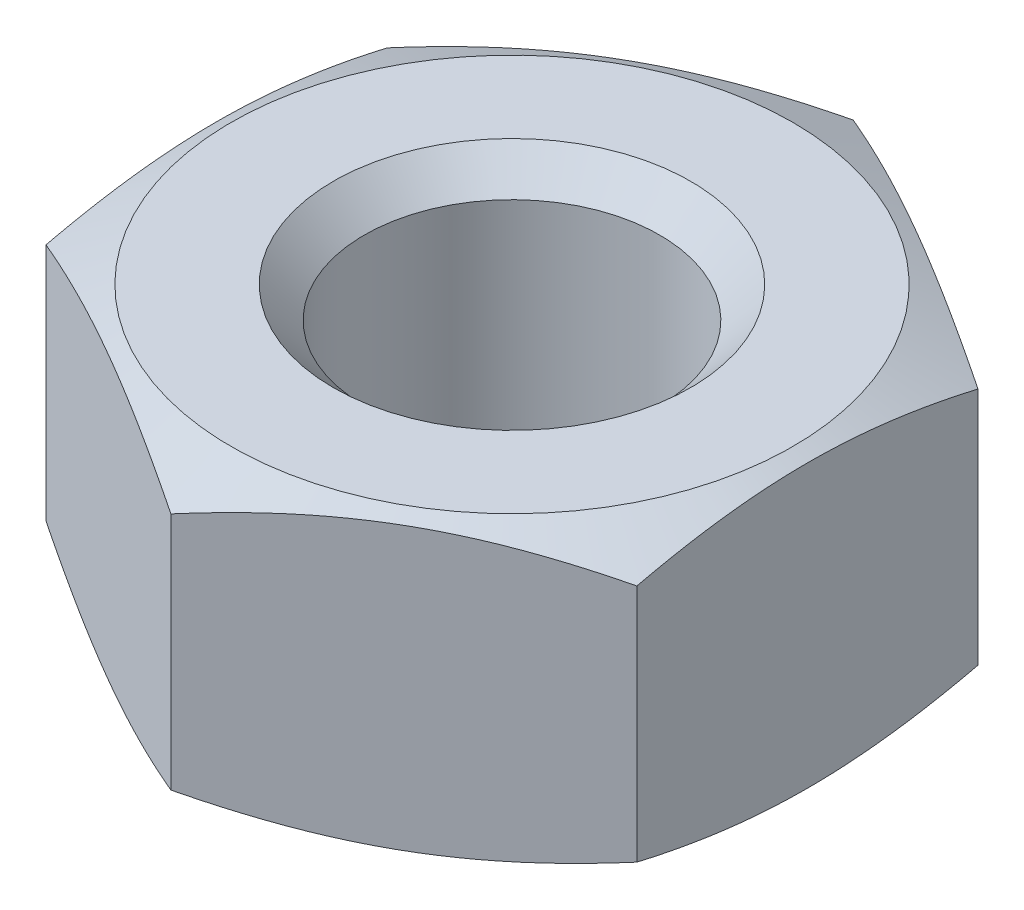
ISO-10303-21;
HEADER;
FILE_DESCRIPTION(('STEP AP214'),'2;1');
FILE_NAME('part.step','',(''),(''),'','','');
FILE_SCHEMA(('AUTOMOTIVE_DESIGN { 1 0 10303 214 1 1 1 1 }'));
ENDSEC;
DATA;
#1=APPLICATION_CONTEXT('core data for automotive mechanical design processes');
#2=APPLICATION_PROTOCOL_DEFINITION('international standard','automotive_design',2000,#1);
#3=PRODUCT_CONTEXT('',#1,'mechanical');
#4=PRODUCT('Part','Part','',(#3));
#5=PRODUCT_RELATED_PRODUCT_CATEGORY('part','',(#4));
#6=PRODUCT_DEFINITION_FORMATION('','',#4);
#7=PRODUCT_DEFINITION_CONTEXT('part definition',#1,'design');
#8=PRODUCT_DEFINITION('design','',#6,#7);
#9=PRODUCT_DEFINITION_SHAPE('','',#8);
#10=(LENGTH_UNIT() NAMED_UNIT(*) SI_UNIT(.MILLI.,.METRE.));
#11=(NAMED_UNIT(*) PLANE_ANGLE_UNIT() SI_UNIT($,.RADIAN.));
#12=(NAMED_UNIT(*) SI_UNIT($,.STERADIAN.) SOLID_ANGLE_UNIT());
#13=UNCERTAINTY_MEASURE_WITH_UNIT(LENGTH_MEASURE(1.E-05),#10,'distance_accuracy_value','');
#14=(GEOMETRIC_REPRESENTATION_CONTEXT(3) GLOBAL_UNCERTAINTY_ASSIGNED_CONTEXT((#13)) GLOBAL_UNIT_ASSIGNED_CONTEXT((#10,
#11,#12)) REPRESENTATION_CONTEXT('',''));
#15=CARTESIAN_POINT('',(0.,0.,0.));
#16=DIRECTION('',(0.,0.,1.));
#17=DIRECTION('',(1.,0.,0.));
#18=AXIS2_PLACEMENT_3D('',#15,#16,#17);
#19=CARTESIAN_POINT('',(5.,2.5,-2.88675134594813));
#20=DIRECTION('',(-0.5,0.,0.866025403784439));
#21=DIRECTION('',(0.866025403784439,0.,0.5));
#22=AXIS2_PLACEMENT_3D('',#19,#20,#21);
#23=PLANE('',#22);
#24=CARTESIAN_POINT('',(-0.000199999999999501,-2.02395974295744,-5.7736181619501));
#25=CARTESIAN_POINT('',(0.151010747855795,-2.06466966086787,-5.68631659597119));
#26=CARTESIAN_POINT('',(0.302779439799255,-2.10276532004087,-5.59869290082308));
#27=CARTESIAN_POINT('',(0.607455751437825,-2.17282066664273,-5.42278795028285));
#28=CARTESIAN_POINT('',(0.760363941140812,-2.20477703433573,-5.33450636579653));
#29=CARTESIAN_POINT('',(1.06732278277276,-2.26162705248396,-5.15728359595019));
#30=CARTESIAN_POINT('',(1.22137437067184,-2.28651405934938,-5.06834187020757));
#31=CARTESIAN_POINT('',(1.53026735132781,-2.32830669777948,-4.89000242467506));
#32=CARTESIAN_POINT('',(1.68510859060131,-2.34521382478051,-4.80060479349884));
#33=CARTESIAN_POINT('',(1.99210751165292,-2.37011273035432,-4.62335888378877));
#34=CARTESIAN_POINT('',(2.14425426385832,-2.37828210107349,-4.53551691544666));
#35=CARTESIAN_POINT('',(2.44872327466207,-2.3859782475379,-4.35973165009921));
#36=CARTESIAN_POINT('',(2.60104554317183,-2.38550450861332,-4.27178834737153));
#37=CARTESIAN_POINT('',(2.9053414063307,-2.37593831564558,-4.09610304886346));
#38=CARTESIAN_POINT('',(3.0573151936295,-2.36685389417962,-4.00836094185674));
#39=CARTESIAN_POINT('',(3.36070746198264,-2.3404574663269,-3.833197334053));
#40=CARTESIAN_POINT('',(3.51212599228864,-2.32314620837124,-3.74577580482053));
#41=CARTESIAN_POINT('',(3.77514799645124,-2.28640873440136,-3.59391997991446));
#42=CARTESIAN_POINT('',(3.886933753904,-2.26868364714663,-3.52938044275754));
#43=CARTESIAN_POINT('',(4.10999421798808,-2.22940536921134,-3.40059642377304));
#44=CARTESIAN_POINT('',(4.22126894566646,-2.20785233766406,-3.33635192979392));
#45=CARTESIAN_POINT('',(4.44416714066287,-2.16108261334641,-3.20766159691086));
#46=CARTESIAN_POINT('',(4.55578612367714,-2.13583763996531,-3.1432183470209));
#47=CARTESIAN_POINT('',(4.77843385126708,-2.08218251009927,-3.01467262156239));
#48=CARTESIAN_POINT('',(4.88946269147448,-2.05377288390758,-2.95057009078084));
#49=CARTESIAN_POINT('',(5.0002,-2.02395974295745,-2.88663587589429));
#50=B_SPLINE_CURVE_WITH_KNOTS('',3,(#24,#25,#26,#27,#28,#29,#30,#31,#32,#33,#34,#35,#36,#37,#38,
#39,#40,#41,#42,#43,#44,#45,#46,#47,#48,#49),.UNSPECIFIED.,.F.,.F.,(4,2,2,2,2,2,2,2,2,2,2,2,4),
(0.,0.537889229661451,1.07606850174431,1.61475187908572,2.15333426657726,2.68074905314433,
3.20819524569605,3.73514988757238,4.26205659926678,4.65287058940701,5.04366833663648,
5.43763379170937,5.83153332996492),.UNSPECIFIED.);
#51=CARTESIAN_POINT('',(0.,-2.02401358914314,-5.77350269189626));
#52=VERTEX_POINT('',#51);
#53=CARTESIAN_POINT('',(5.,-2.02401358914314,-2.88675134594813));
#54=VERTEX_POINT('',#53);
#55=EDGE_CURVE('E59',#52,#54,#50,.T.);
#56=ORIENTED_EDGE('',*,*,#55,.F.);
#57=DIRECTION('',(0.,-1.,0.));
#58=VECTOR('',#57,1.);
#59=CARTESIAN_POINT('',(0.,2.5,-5.77350269189626));
#60=LINE('',#59,#58);
#61=CARTESIAN_POINT('',(0.,2.02401358914314,-5.77350269189626));
#62=VERTEX_POINT('',#61);
#63=EDGE_CURVE('E11',#62,#52,#60,.T.);
#64=ORIENTED_EDGE('',*,*,#63,.F.);
#65=CARTESIAN_POINT('',(5.0002,2.02395974295745,-2.88663587589429));
#66=CARTESIAN_POINT('',(4.8489892521442,2.06466966086787,-2.9739374418732));
#67=CARTESIAN_POINT('',(4.69722056020074,2.10276532004087,-3.06156113702132));
#68=CARTESIAN_POINT('',(4.39254424856217,2.17282066664273,-3.23746608756155));
#69=CARTESIAN_POINT('',(4.23963605885919,2.20477703433573,-3.32574767204786));
#70=CARTESIAN_POINT('',(3.93267721722724,2.26162705248396,-3.50297044189421));
#71=CARTESIAN_POINT('',(3.77862562932816,2.28651405934938,-3.59191216763683));
#72=CARTESIAN_POINT('',(3.46973264867219,2.32830669777948,-3.77025161316934));
#73=CARTESIAN_POINT('',(3.31489140939869,2.34521382478051,-3.85964924434555));
#74=CARTESIAN_POINT('',(3.00789248834708,2.37011273035432,-4.03689515405562));
#75=CARTESIAN_POINT('',(2.85574573614168,2.37828210107349,-4.12473712239773));
#76=CARTESIAN_POINT('',(2.55127672533793,2.3859782475379,-4.30052238774518));
#77=CARTESIAN_POINT('',(2.39895445682817,2.38550450861332,-4.38846569047286));
#78=CARTESIAN_POINT('',(2.0946585936693,2.37593831564558,-4.56415098898093));
#79=CARTESIAN_POINT('',(1.9426848063705,2.36685389417962,-4.65189309598766));
#80=CARTESIAN_POINT('',(1.63929253801736,2.3404574663269,-4.8270567037914));
#81=CARTESIAN_POINT('',(1.48787400771136,2.32314620837124,-4.91447823302386));
#82=CARTESIAN_POINT('',(1.22485200354876,2.28640873440136,-5.06633405792993));
#83=CARTESIAN_POINT('',(1.113066246096,2.26868364714663,-5.13087359508685));
#84=CARTESIAN_POINT('',(0.890005782011924,2.22940536921134,-5.25965761407135));
#85=CARTESIAN_POINT('',(0.778731054333542,2.20785233766406,-5.32390210805047));
#86=CARTESIAN_POINT('',(0.555832859337129,2.16108261334641,-5.45259244093353));
#87=CARTESIAN_POINT('',(0.444213876322858,2.13583763996531,-5.51703569082349));
#88=CARTESIAN_POINT('',(0.22156614873292,2.08218251009927,-5.645581416282));
#89=CARTESIAN_POINT('',(0.110537308525522,2.05377288390758,-5.70968394706355));
#90=CARTESIAN_POINT('',(-0.00020000000000042,2.02395974295745,-5.7736181619501));
#91=B_SPLINE_CURVE_WITH_KNOTS('',3,(#65,#66,#67,#68,#69,#70,#71,#72,#73,#74,#75,#76,#77,#78,#79,
#80,#81,#82,#83,#84,#85,#86,#87,#88,#89,#90),.UNSPECIFIED.,.F.,.F.,(4,2,2,2,2,2,2,2,2,2,2,2,4),
(0.,0.537889229661452,1.07606850174431,1.61475187908572,2.15333426657726,2.68074905314434,
3.20819524569605,3.73514988757238,4.26205659926678,4.65287058940702,5.04366833663648,
5.43763379170937,5.83153332996492),.UNSPECIFIED.);
#92=CARTESIAN_POINT('',(5.,2.02401358914314,-2.88675134594813));
#93=VERTEX_POINT('',#92);
#94=EDGE_CURVE('E120',#93,#62,#91,.T.);
#95=ORIENTED_EDGE('',*,*,#94,.F.);
#96=DIRECTION('',(0.,-1.,0.));
#97=VECTOR('',#96,1.);
#98=CARTESIAN_POINT('',(5.,2.5,-2.88675134594813));
#99=LINE('',#98,#97);
#100=EDGE_CURVE('E116',#93,#54,#99,.T.);
#101=ORIENTED_EDGE('',*,*,#100,.T.);
#102=EDGE_LOOP('',(#56,#64,#95,#101));
#103=FACE_BOUND('',#102,.T.);
#104=ADVANCED_FACE('F44',(#103),#23,.F.);
#105=CARTESIAN_POINT('',(0.,2.5,-5.77350269189626));
#106=DIRECTION('',(0.5,0.,0.866025403784439));
#107=DIRECTION('',(0.866025403784439,0.,-0.5));
#108=AXIS2_PLACEMENT_3D('',#105,#106,#107);
#109=PLANE('',#108);
#110=CARTESIAN_POINT('',(-5.0002,-2.02395974295744,-2.88663587589429));
#111=CARTESIAN_POINT('',(-4.84898925214421,-2.06466966086787,-2.9739374418732));
#112=CARTESIAN_POINT('',(-4.69722056020075,-2.10276532004087,-3.06156113702132));
#113=CARTESIAN_POINT('',(-4.39254424856218,-2.17282066664273,-3.23746608756155));
#114=CARTESIAN_POINT('',(-4.23963605885919,-2.20477703433572,-3.32574767204786));
#115=CARTESIAN_POINT('',(-3.93267721722724,-2.26162705248395,-3.50297044189421));
#116=CARTESIAN_POINT('',(-3.77862562932816,-2.28651405934938,-3.59191216763683));
#117=CARTESIAN_POINT('',(-3.4697326486722,-2.32830669777948,-3.77025161316934));
#118=CARTESIAN_POINT('',(-3.31489140939869,-2.34521382478051,-3.85964924434555));
#119=CARTESIAN_POINT('',(-3.00789248834708,-2.37011273035432,-4.03689515405562));
#120=CARTESIAN_POINT('',(-2.85574573614169,-2.37828210107349,-4.12473712239773));
#121=CARTESIAN_POINT('',(-2.55127672533793,-2.3859782475379,-4.30052238774518));
#122=CARTESIAN_POINT('',(-2.39895445682818,-2.38550450861332,-4.38846569047286));
#123=CARTESIAN_POINT('',(-2.0946585936693,-2.37593831564558,-4.56415098898093));
#124=CARTESIAN_POINT('',(-1.9426848063705,-2.36685389417962,-4.65189309598766));
#125=CARTESIAN_POINT('',(-1.63929253801736,-2.3404574663269,-4.82705670379139));
#126=CARTESIAN_POINT('',(-1.48787400771136,-2.32314620837124,-4.91447823302386));
#127=CARTESIAN_POINT('',(-1.22485200354876,-2.28640873440136,-5.06633405792993));
#128=CARTESIAN_POINT('',(-1.113066246096,-2.26868364714663,-5.13087359508685));
#129=CARTESIAN_POINT('',(-0.890005782011924,-2.22940536921134,-5.25965761407135));
#130=CARTESIAN_POINT('',(-0.778731054333543,-2.20785233766406,-5.32390210805047));
#131=CARTESIAN_POINT('',(-0.55583285933713,-2.16108261334641,-5.45259244093353));
#132=CARTESIAN_POINT('',(-0.444213876322859,-2.13583763996531,-5.51703569082349));
#133=CARTESIAN_POINT('',(-0.22156614873292,-2.08218251009927,-5.645581416282));
#134=CARTESIAN_POINT('',(-0.110537308525522,-2.05377288390758,-5.70968394706355));
#135=CARTESIAN_POINT('',(0.000200000000001096,-2.02395974295745,-5.7736181619501));
#136=B_SPLINE_CURVE_WITH_KNOTS('',3,(#110,#111,#112,#113,#114,#115,#116,#117,#118,#119,#120,
#121,#122,#123,#124,#125,#126,#127,#128,#129,#130,#131,#132,#133,#134,#135),.UNSPECIFIED.,.F.,
.F.,(4,2,2,2,2,2,2,2,2,2,2,2,4),(0.,0.537889229661451,1.07606850174431,1.61475187908572,
2.15333426657726,2.68074905314434,3.20819524569605,3.73514988757238,4.26205659926678,
4.65287058940702,5.04366833663648,5.43763379170937,5.83153332996492),.UNSPECIFIED.);
#137=CARTESIAN_POINT('',(-5.,-2.02401358914314,-2.88675134594813));
#138=VERTEX_POINT('',#137);
#139=EDGE_CURVE('E140',#138,#52,#136,.T.);
#140=ORIENTED_EDGE('',*,*,#139,.F.);
#141=DIRECTION('',(0.,-1.,0.));
#142=VECTOR('',#141,1.);
#143=CARTESIAN_POINT('',(-5.,2.5,-2.88675134594813));
#144=LINE('',#143,#142);
#145=CARTESIAN_POINT('',(-5.,2.02401358914327,-2.88675134594827));
#146=VERTEX_POINT('',#145);
#147=EDGE_CURVE('E52',#146,#138,#144,.T.);
#148=ORIENTED_EDGE('',*,*,#147,.F.);
#149=CARTESIAN_POINT('',(0.000200000000000588,2.02395974295744,-5.7736181619501));
#150=CARTESIAN_POINT('',(-0.151010747855794,2.06466966086787,-5.68631659597119));
#151=CARTESIAN_POINT('',(-0.302779439799254,2.10276532004087,-5.59869290082308));
#152=CARTESIAN_POINT('',(-0.607455751437824,2.17282066664273,-5.42278795028285));
#153=CARTESIAN_POINT('',(-0.760363941140811,2.20477703433573,-5.33450636579653));
#154=CARTESIAN_POINT('',(-1.06732278277276,2.26162705248396,-5.15728359595019));
#155=CARTESIAN_POINT('',(-1.22137437067184,2.28651405934938,-5.06834187020757));
#156=CARTESIAN_POINT('',(-1.5302673513278,2.32830669777948,-4.89000242467506));
#157=CARTESIAN_POINT('',(-1.68510859060131,2.34521382478051,-4.80060479349884));
#158=CARTESIAN_POINT('',(-1.99210751165292,2.37011273035432,-4.62335888378877));
#159=CARTESIAN_POINT('',(-2.14425426385831,2.37828210107349,-4.53551691544666));
#160=CARTESIAN_POINT('',(-2.44872327466207,2.3859782475379,-4.35973165009921));
#161=CARTESIAN_POINT('',(-2.60104554317182,2.38550450861332,-4.27178834737153));
#162=CARTESIAN_POINT('',(-2.9053414063307,2.37593831564558,-4.09610304886346));
#163=CARTESIAN_POINT('',(-3.0573151936295,2.36685389417962,-4.00836094185674));
#164=CARTESIAN_POINT('',(-3.36070746198264,2.3404574663269,-3.833197334053));
#165=CARTESIAN_POINT('',(-3.51212599228864,2.32314620837124,-3.74577580482053));
#166=CARTESIAN_POINT('',(-3.77514799645124,2.28640873440136,-3.59391997991446));
#167=CARTESIAN_POINT('',(-3.886933753904,2.26868364714663,-3.52938044275754));
#168=CARTESIAN_POINT('',(-4.10999421798808,2.22940536921134,-3.40059642377304));
#169=CARTESIAN_POINT('',(-4.22126894566646,2.20785233766406,-3.33635192979392));
#170=CARTESIAN_POINT('',(-4.44416714066287,2.16108261334641,-3.20766159691086));
#171=CARTESIAN_POINT('',(-4.55578612367714,2.13583763996531,-3.1432183470209));
#172=CARTESIAN_POINT('',(-4.77843385126708,2.08218251009927,-3.01467262156239));
#173=CARTESIAN_POINT('',(-4.88946269147448,2.05377288390758,-2.95057009078084));
#174=CARTESIAN_POINT('',(-5.0002,2.02395974295745,-2.88663587589429));
#175=B_SPLINE_CURVE_WITH_KNOTS('',3,(#149,#150,#151,#152,#153,#154,#155,#156,#157,#158,#159,
#160,#161,#162,#163,#164,#165,#166,#167,#168,#169,#170,#171,#172,#173,#174),.UNSPECIFIED.,.F.,
.F.,(4,2,2,2,2,2,2,2,2,2,2,2,4),(0.,0.537889229661451,1.07606850174431,1.61475187908572,
2.15333426657726,2.68074905314433,3.20819524569605,3.73514988757238,4.26205659926678,
4.65287058940701,5.04366833663648,5.43763379170937,5.83153332996492),.UNSPECIFIED.);
#176=EDGE_CURVE('E138',#62,#146,#175,.T.);
#177=ORIENTED_EDGE('',*,*,#176,.F.);
#178=ORIENTED_EDGE('',*,*,#63,.T.);
#179=EDGE_LOOP('',(#140,#148,#177,#178));
#180=FACE_BOUND('',#179,.T.);
#181=ADVANCED_FACE('F137',(#180),#109,.F.);
#182=CARTESIAN_POINT('',(-5.,2.5,-2.88675134594813));
#183=DIRECTION('',(1.,0.,0.));
#184=DIRECTION('',(0.,0.,-1.));
#185=AXIS2_PLACEMENT_3D('',#182,#183,#184);
#186=PLANE('',#185);
#187=CARTESIAN_POINT('',(-5.,-0.044355056732801,8.68206422951937));
#188=CARTESIAN_POINT('',(-5.,-0.150884469076181,8.41835004983136));
#189=CARTESIAN_POINT('',(-5.,-0.256433427007577,8.15423225122912));
#190=CARTESIAN_POINT('',(-5.,-0.464928591610989,7.62493349407754));
#191=CARTESIAN_POINT('',(-5.,-0.567874463325021,7.35975240374208));
#192=CARTESIAN_POINT('',(-5.,-0.770937882882647,6.82697393506281));
#193=CARTESIAN_POINT('',(-5.,-0.871041062323284,6.5593710605834));
#194=CARTESIAN_POINT('',(-5.,-1.06698727838262,6.02261491900011));
#195=CARTESIAN_POINT('',(-5.,-1.16283047121933,5.75346170915815));
#196=CARTESIAN_POINT('',(-5.,-1.34807184925945,5.21585645246179));
#197=CARTESIAN_POINT('',(-5.,-1.43752355244403,4.94742294797703));
#198=CARTESIAN_POINT('',(-5.,-1.60929552371131,4.40824161312915));
#199=CARTESIAN_POINT('',(-5.,-1.69161524445637,4.13749360689038));
#200=CARTESIAN_POINT('',(-5.,-1.84673417591742,3.5936075577031));
#201=CARTESIAN_POINT('',(-5.,-1.91954467826691,3.3204727679688));
#202=CARTESIAN_POINT('',(-5.,-2.05279031206892,2.77119019583892));
#203=CARTESIAN_POINT('',(-5.,-2.11322774023882,2.49504298265793));
#204=CARTESIAN_POINT('',(-5.,-2.20302621029005,2.0200006792832));
#205=CARTESIAN_POINT('',(-5.,-2.23632012033309,1.82185262645441));
#206=CARTESIAN_POINT('',(-5.,-2.29356818033828,1.42419953935815));
#207=CARTESIAN_POINT('',(-5.,-2.31752276298611,1.22469456839172));
#208=CARTESIAN_POINT('',(-5.,-2.35494795919522,0.824903595246671));
#209=CARTESIAN_POINT('',(-5.,-2.36842974797415,0.624618655424731));
#210=CARTESIAN_POINT('',(-5.,-2.38423293699881,0.223604646465163));
#211=CARTESIAN_POINT('',(-5.,-2.38655454290924,0.0228755855801934));
#212=CARTESIAN_POINT('',(-5.,-2.37990591658309,-0.378466308609174));
#213=CARTESIAN_POINT('',(-5.,-2.3709315094048,-0.579079071508225));
#214=CARTESIAN_POINT('',(-5.,-2.34217739493285,-0.979521857267586));
#215=CARTESIAN_POINT('',(-5.,-2.32239733699088,-1.17935185451484));
#216=CARTESIAN_POINT('',(-5.,-2.272989768859,-1.5780081686592));
#217=CARTESIAN_POINT('',(-5.,-2.2433508671486,-1.77683305313053));
#218=CARTESIAN_POINT('',(-5.,-2.17548381666928,-2.17301946195068));
#219=CARTESIAN_POINT('',(-5.,-2.13725446483389,-2.37038077732804));
#220=CARTESIAN_POINT('',(-5.,-2.03943959970523,-2.82968647684002));
#221=CARTESIAN_POINT('',(-5.,-1.97699631240073,-3.09101885139498));
#222=CARTESIAN_POINT('',(-5.,-1.8419944231657,-3.61104592530385));
#223=CARTESIAN_POINT('',(-5.,-1.76943463425191,-3.86974031131106));
#224=CARTESIAN_POINT('',(-5.,-1.61650141457036,-4.38492940863246));
#225=CARTESIAN_POINT('',(-5.,-1.53612412876673,-4.64142296611522));
#226=CARTESIAN_POINT('',(-5.,-1.36939229492986,-5.15243128838049));
#227=CARTESIAN_POINT('',(-5.,-1.28303806021906,-5.40694615611264));
#228=CARTESIAN_POINT('',(-5.,-1.10535214489103,-5.91535529177718));
#229=CARTESIAN_POINT('',(-5.,-1.01400212071026,-6.16924311888274));
#230=CARTESIAN_POINT('',(-5.,-0.827656953692517,-6.67568081355491));
#231=CARTESIAN_POINT('',(-5.,-0.732661711287995,-6.92823064436));
#232=CARTESIAN_POINT('',(-5.,-0.540072160435029,-7.43152003905333));
#233=CARTESIAN_POINT('',(-5.,-0.442485910288777,-7.68226269623553));
#234=CARTESIAN_POINT('',(-5.,-0.245012485290529,-8.18281252227002));
#235=CARTESIAN_POINT('',(-5.,-0.14512553963842,-8.43261978145063));
#236=CARTESIAN_POINT('',(-5.,-0.0443550567328003,-8.68206422951937));
#237=B_SPLINE_CURVE_WITH_KNOTS('',3,(#187,#188,#189,#190,#191,#192,#193,#194,#195,#196,#197,
#198,#199,#200,#201,#202,#203,#204,#205,#206,#207,#208,#209,#210,#211,#212,#213,#214,#215,#216,
#217,#218,#219,#220,#221,#222,#223,#224,#225,#226,#227,#228,#229,#230,#231,#232,#233,#234,#235,
#236),.UNSPECIFIED.,.F.,.F.,(4,2,2,2,2,2,2,2,2,2,2,2,2,2,2,2,2,2,2,2,2,2,2,2,4),(0.,
0.853262994718523,1.70663523192458,2.56374647250866,3.42082625598369,4.26958875926238,
5.11841634247064,5.96622664711135,6.81387943635441,7.41646993512965,8.01903251291344,
8.62095122685452,9.22285884833298,9.82498899675586,10.4271386857382,11.0299865668377,
11.6329189276299,12.4387075097962,13.2445907159496,14.0508733612321,14.8571137716898,
15.6665444626183,16.475997278551,17.2831742830016,18.0902712197221),.UNSPECIFIED.);
#238=CARTESIAN_POINT('',(-5.,-2.02401358914314,2.88675134594813));
#239=VERTEX_POINT('',#238);
#240=EDGE_CURVE('E132',#239,#138,#237,.T.);
#241=ORIENTED_EDGE('',*,*,#240,.F.);
#242=DIRECTION('',(0.,-1.,0.));
#243=VECTOR('',#242,1.);
#244=CARTESIAN_POINT('',(-5.,2.5,2.88675134594813));
#245=LINE('',#244,#243);
#246=CARTESIAN_POINT('',(-5.,2.02401358914314,2.88675134594813));
#247=VERTEX_POINT('',#246);
#248=EDGE_CURVE('E118',#247,#239,#245,.T.);
#249=ORIENTED_EDGE('',*,*,#248,.F.);
#250=CARTESIAN_POINT('',(-5.,0.0443550567327995,-8.68206422951937));
#251=CARTESIAN_POINT('',(-5.,0.150884469076181,-8.41835004983137));
#252=CARTESIAN_POINT('',(-5.,0.256433427007577,-8.15423225122912));
#253=CARTESIAN_POINT('',(-5.,0.464928591610988,-7.62493349407755));
#254=CARTESIAN_POINT('',(-5.,0.567874463325019,-7.35975240374208));
#255=CARTESIAN_POINT('',(-5.,0.770937882882646,-6.82697393506282));
#256=CARTESIAN_POINT('',(-5.,0.871041062323283,-6.5593710605834));
#257=CARTESIAN_POINT('',(-5.,1.06698727838262,-6.02261491900012));
#258=CARTESIAN_POINT('',(-5.,1.16283047121933,-5.75346170915815));
#259=CARTESIAN_POINT('',(-5.,1.34807184925944,-5.21585645246179));
#260=CARTESIAN_POINT('',(-5.,1.43752355244403,-4.94742294797703));
#261=CARTESIAN_POINT('',(-5.,1.60929552371131,-4.40824161312915));
#262=CARTESIAN_POINT('',(-5.,1.69161524445637,-4.13749360689038));
#263=CARTESIAN_POINT('',(-5.,1.84673417591742,-3.5936075577031));
#264=CARTESIAN_POINT('',(-5.,1.91954467826691,-3.3204727679688));
#265=CARTESIAN_POINT('',(-5.,2.05279031206892,-2.77119019583892));
#266=CARTESIAN_POINT('',(-5.,2.11322774023882,-2.49504298265793));
#267=CARTESIAN_POINT('',(-5.,2.20302621029005,-2.0200006792832));
#268=CARTESIAN_POINT('',(-5.,2.23632012033309,-1.82185262645441));
#269=CARTESIAN_POINT('',(-5.,2.29356818033828,-1.42419953935815));
#270=CARTESIAN_POINT('',(-5.,2.31752276298611,-1.22469456839172));
#271=CARTESIAN_POINT('',(-5.,2.35494795919522,-0.82490359524667));
#272=CARTESIAN_POINT('',(-5.,2.36842974797415,-0.62461865542473));
#273=CARTESIAN_POINT('',(-5.,2.38423293699881,-0.223604646465162));
#274=CARTESIAN_POINT('',(-5.,2.38655454290924,-0.0228755855801926));
#275=CARTESIAN_POINT('',(-5.,2.37990591658309,0.378466308609175));
#276=CARTESIAN_POINT('',(-5.,2.3709315094048,0.579079071508226));
#277=CARTESIAN_POINT('',(-5.,2.34217739493285,0.979521857267588));
#278=CARTESIAN_POINT('',(-5.,2.32239733699088,1.17935185451484));
#279=CARTESIAN_POINT('',(-5.,2.272989768859,1.5780081686592));
#280=CARTESIAN_POINT('',(-5.,2.24335086714859,1.77683305313053));
#281=CARTESIAN_POINT('',(-5.,2.17548381666928,2.17301946195069));
#282=CARTESIAN_POINT('',(-5.,2.13725446483389,2.37038077732804));
#283=CARTESIAN_POINT('',(-5.,2.03943959970523,2.82968647684003));
#284=CARTESIAN_POINT('',(-5.,1.97699631240073,3.09101885139498));
#285=CARTESIAN_POINT('',(-5.,1.8419944231657,3.61104592530385));
#286=CARTESIAN_POINT('',(-5.,1.76943463425191,3.86974031131106));
#287=CARTESIAN_POINT('',(-5.,1.61650141457036,4.38492940863246));
#288=CARTESIAN_POINT('',(-5.,1.53612412876673,4.64142296611522));
#289=CARTESIAN_POINT('',(-5.,1.36939229492987,5.15243128838049));
#290=CARTESIAN_POINT('',(-5.,1.28303806021906,5.40694615611264));
#291=CARTESIAN_POINT('',(-5.,1.10535214489103,5.91535529177718));
#292=CARTESIAN_POINT('',(-5.,1.01400212071026,6.16924311888274));
#293=CARTESIAN_POINT('',(-5.,0.827656953692516,6.67568081355491));
#294=CARTESIAN_POINT('',(-5.,0.732661711287995,6.92823064436));
#295=CARTESIAN_POINT('',(-5.,0.54007216043503,7.43152003905333));
#296=CARTESIAN_POINT('',(-5.,0.442485910288778,7.68226269623553));
#297=CARTESIAN_POINT('',(-5.,0.24501248529053,8.18281252227002));
#298=CARTESIAN_POINT('',(-5.,0.145125539638421,8.43261978145063));
#299=CARTESIAN_POINT('',(-5.,0.0443550567328014,8.68206422951937));
#300=B_SPLINE_CURVE_WITH_KNOTS('',3,(#250,#251,#252,#253,#254,#255,#256,#257,#258,#259,#260,
#261,#262,#263,#264,#265,#266,#267,#268,#269,#270,#271,#272,#273,#274,#275,#276,#277,#278,#279,
#280,#281,#282,#283,#284,#285,#286,#287,#288,#289,#290,#291,#292,#293,#294,#295,#296,#297,#298,
#299),.UNSPECIFIED.,.F.,.F.,(4,2,2,2,2,2,2,2,2,2,2,2,2,2,2,2,2,2,2,2,2,2,2,2,4),(0.,
0.853262994718523,1.70663523192458,2.56374647250866,3.4208262559837,4.26958875926238,
5.11841634247065,5.96622664711135,6.81387943635441,7.41646993512966,8.01903251291345,
8.62095122685453,9.22285884833299,9.82498899675587,10.4271386857382,11.0299865668377,
11.63291892763,12.4387075097962,13.2445907159496,14.0508733612321,14.8571137716898,
15.6665444626183,16.475997278551,17.2831742830016,18.0902712197221),.UNSPECIFIED.);
#301=EDGE_CURVE('E133',#146,#247,#300,.T.);
#302=ORIENTED_EDGE('',*,*,#301,.F.);
#303=ORIENTED_EDGE('',*,*,#147,.T.);
#304=EDGE_LOOP('',(#241,#249,#302,#303));
#305=FACE_BOUND('',#304,.T.);
#306=ADVANCED_FACE('F130',(#305),#186,.F.);
#307=CARTESIAN_POINT('',(-5.,2.5,2.88675134594813));
#308=DIRECTION('',(0.5,0.,-0.866025403784438));
#309=DIRECTION('',(-0.866025403784439,0.,-0.5));
#310=AXIS2_PLACEMENT_3D('',#307,#308,#309);
#311=PLANE('',#310);
#312=CARTESIAN_POINT('',(0.00019999999999886,-2.02395974295745,5.7736181619501));
#313=CARTESIAN_POINT('',(-0.151010747855795,-2.06466966086787,5.68631659597119));
#314=CARTESIAN_POINT('',(-0.302779439799255,-2.10276532004087,5.59869290082307));
#315=CARTESIAN_POINT('',(-0.607455751437826,-2.17282066664273,5.42278795028284));
#316=CARTESIAN_POINT('',(-0.760363941140813,-2.20477703433573,5.33450636579652));
#317=CARTESIAN_POINT('',(-1.06732278277276,-2.26162705248396,5.15728359595018));
#318=CARTESIAN_POINT('',(-1.22137437067184,-2.28651405934938,5.06834187020756));
#319=CARTESIAN_POINT('',(-1.53026735132781,-2.32830669777948,4.89000242467505));
#320=CARTESIAN_POINT('',(-1.68510859060131,-2.34521382478051,4.80060479349884));
#321=CARTESIAN_POINT('',(-1.99210751165292,-2.37011273035432,4.62335888378877));
#322=CARTESIAN_POINT('',(-2.14425426385832,-2.37828210107349,4.53551691544666));
#323=CARTESIAN_POINT('',(-2.44872327466207,-2.3859782475379,4.35973165009921));
#324=CARTESIAN_POINT('',(-2.60104554317183,-2.38550450861332,4.27178834737153));
#325=CARTESIAN_POINT('',(-2.9053414063307,-2.37593831564558,4.09610304886346));
#326=CARTESIAN_POINT('',(-3.0573151936295,-2.36685389417962,4.00836094185673));
#327=CARTESIAN_POINT('',(-3.36070746198264,-2.3404574663269,3.83319733405299));
#328=CARTESIAN_POINT('',(-3.51212599228864,-2.32314620837124,3.74577580482053));
#329=CARTESIAN_POINT('',(-3.77514799645124,-2.28640873440136,3.59391997991446));
#330=CARTESIAN_POINT('',(-3.886933753904,-2.26868364714663,3.52938044275754));
#331=CARTESIAN_POINT('',(-4.10999421798808,-2.22940536921134,3.40059642377304));
#332=CARTESIAN_POINT('',(-4.22126894566646,-2.20785233766406,3.33635192979392));
#333=CARTESIAN_POINT('',(-4.44416714066287,-2.16108261334641,3.20766159691086));
#334=CARTESIAN_POINT('',(-4.55578612367714,-2.13583763996531,3.1432183470209));
#335=CARTESIAN_POINT('',(-4.77843385126708,-2.08218251009927,3.01467262156239));
#336=CARTESIAN_POINT('',(-4.88946269147448,-2.05377288390758,2.95057009078083));
#337=CARTESIAN_POINT('',(-5.0002,-2.02395974295745,2.88663587589429));
#338=B_SPLINE_CURVE_WITH_KNOTS('',3,(#312,#313,#314,#315,#316,#317,#318,#319,#320,#321,#322,
#323,#324,#325,#326,#327,#328,#329,#330,#331,#332,#333,#334,#335,#336,#337),.UNSPECIFIED.,.F.,
.F.,(4,2,2,2,2,2,2,2,2,2,2,2,4),(0.,0.537889229661452,1.07606850174432,1.61475187908572,
2.15333426657726,2.68074905314434,3.20819524569605,3.73514988757238,4.26205659926679,
4.65287058940702,5.04366833663649,5.43763379170937,5.83153332996492),.UNSPECIFIED.);
#339=CARTESIAN_POINT('',(0.,-2.02401358914314,5.77350269189626));
#340=VERTEX_POINT('',#339);
#341=EDGE_CURVE('E112',#340,#239,#338,.T.);
#342=ORIENTED_EDGE('',*,*,#341,.F.);
#343=DIRECTION('',(0.,-1.,0.));
#344=VECTOR('',#343,1.);
#345=CARTESIAN_POINT('',(0.,2.5,5.77350269189626));
#346=LINE('',#345,#344);
#347=CARTESIAN_POINT('',(0.,2.02401358914314,5.77350269189626));
#348=VERTEX_POINT('',#347);
#349=EDGE_CURVE('E111',#348,#340,#346,.T.);
#350=ORIENTED_EDGE('',*,*,#349,.F.);
#351=CARTESIAN_POINT('',(-5.0002,2.02395974295745,2.88663587589429));
#352=CARTESIAN_POINT('',(-4.84898925214421,2.06466966086787,2.9739374418732));
#353=CARTESIAN_POINT('',(-4.69722056020075,2.10276532004087,3.06156113702131));
#354=CARTESIAN_POINT('',(-4.39254424856218,2.17282066664273,3.23746608756154));
#355=CARTESIAN_POINT('',(-4.23963605885919,2.20477703433573,3.32574767204786));
#356=CARTESIAN_POINT('',(-3.93267721722724,2.26162705248396,3.5029704418942));
#357=CARTESIAN_POINT('',(-3.77862562932816,2.28651405934938,3.59191216763682));
#358=CARTESIAN_POINT('',(-3.4697326486722,2.32830669777948,3.77025161316933));
#359=CARTESIAN_POINT('',(-3.31489140939869,2.34521382478051,3.85964924434555));
#360=CARTESIAN_POINT('',(-3.00789248834708,2.37011273035432,4.03689515405562));
#361=CARTESIAN_POINT('',(-2.85574573614169,2.37828210107349,4.12473712239773));
#362=CARTESIAN_POINT('',(-2.55127672533793,2.3859782475379,4.30052238774518));
#363=CARTESIAN_POINT('',(-2.39895445682818,2.38550450861332,4.38846569047286));
#364=CARTESIAN_POINT('',(-2.0946585936693,2.37593831564558,4.56415098898093));
#365=CARTESIAN_POINT('',(-1.9426848063705,2.36685389417962,4.65189309598765));
#366=CARTESIAN_POINT('',(-1.63929253801736,2.3404574663269,4.82705670379139));
#367=CARTESIAN_POINT('',(-1.48787400771136,2.32314620837124,4.91447823302386));
#368=CARTESIAN_POINT('',(-1.22485200354876,2.28640873440136,5.06633405792993));
#369=CARTESIAN_POINT('',(-1.113066246096,2.26868364714663,5.13087359508685));
#370=CARTESIAN_POINT('',(-0.890005782011926,2.22940536921134,5.25965761407135));
#371=CARTESIAN_POINT('',(-0.778731054333544,2.20785233766406,5.32390210805047));
#372=CARTESIAN_POINT('',(-0.555832859337131,2.16108261334641,5.45259244093353));
#373=CARTESIAN_POINT('',(-0.44421387632286,2.13583763996531,5.51703569082349));
#374=CARTESIAN_POINT('',(-0.221566148732922,2.08218251009927,5.645581416282));
#375=CARTESIAN_POINT('',(-0.110537308525524,2.05377288390758,5.70968394706355));
#376=CARTESIAN_POINT('',(0.000199999999998899,2.02395974295745,5.7736181619501));
#377=B_SPLINE_CURVE_WITH_KNOTS('',3,(#351,#352,#353,#354,#355,#356,#357,#358,#359,#360,#361,
#362,#363,#364,#365,#366,#367,#368,#369,#370,#371,#372,#373,#374,#375,#376),.UNSPECIFIED.,.F.,
.F.,(4,2,2,2,2,2,2,2,2,2,2,2,4),(0.,0.537889229661452,1.07606850174432,1.61475187908572,
2.15333426657726,2.68074905314434,3.20819524569606,3.73514988757238,4.26205659926678,
4.65287058940701,5.04366833663648,5.43763379170937,5.83153332996492),.UNSPECIFIED.);
#378=EDGE_CURVE('E203',#247,#348,#377,.T.);
#379=ORIENTED_EDGE('',*,*,#378,.F.);
#380=ORIENTED_EDGE('',*,*,#248,.T.);
#381=EDGE_LOOP('',(#342,#350,#379,#380));
#382=FACE_BOUND('',#381,.T.);
#383=ADVANCED_FACE('F195',(#382),#311,.F.);
#384=CARTESIAN_POINT('',(0.,2.5,5.77350269189626));
#385=DIRECTION('',(-0.5,0.,-0.866025403784439));
#386=DIRECTION('',(-0.866025403784439,0.,0.5));
#387=AXIS2_PLACEMENT_3D('',#384,#385,#386);
#388=PLANE('',#387);
#389=CARTESIAN_POINT('',(5.0002,-2.02395974295745,2.88663587589429));
#390=CARTESIAN_POINT('',(4.8489892521442,-2.06466966086787,2.9739374418732));
#391=CARTESIAN_POINT('',(4.69722056020074,-2.10276532004087,3.06156113702131));
#392=CARTESIAN_POINT('',(4.39254424856217,-2.17282066664273,3.23746608756155));
#393=CARTESIAN_POINT('',(4.23963605885919,-2.20477703433573,3.32574767204786));
#394=CARTESIAN_POINT('',(3.93267721722724,-2.26162705248396,3.5029704418942));
#395=CARTESIAN_POINT('',(3.77862562932816,-2.28651405934938,3.59191216763682));
#396=CARTESIAN_POINT('',(3.46973264867219,-2.32830669777948,3.77025161316933));
#397=CARTESIAN_POINT('',(3.31489140939869,-2.34521382478051,3.85964924434555));
#398=CARTESIAN_POINT('',(3.00789248834708,-2.37011273035432,4.03689515405562));
#399=CARTESIAN_POINT('',(2.85574573614168,-2.37828210107349,4.12473712239773));
#400=CARTESIAN_POINT('',(2.55127672533793,-2.3859782475379,4.30052238774518));
#401=CARTESIAN_POINT('',(2.39895445682817,-2.38550450861332,4.38846569047286));
#402=CARTESIAN_POINT('',(2.0946585936693,-2.37593831564558,4.56415098898092));
#403=CARTESIAN_POINT('',(1.9426848063705,-2.36685389417962,4.65189309598765));
#404=CARTESIAN_POINT('',(1.63929253801736,-2.3404574663269,4.82705670379139));
#405=CARTESIAN_POINT('',(1.48787400771136,-2.32314620837124,4.91447823302386));
#406=CARTESIAN_POINT('',(1.22485200354876,-2.28640873440136,5.06633405792993));
#407=CARTESIAN_POINT('',(1.113066246096,-2.26868364714663,5.13087359508685));
#408=CARTESIAN_POINT('',(0.890005782011923,-2.22940536921134,5.25965761407135));
#409=CARTESIAN_POINT('',(0.778731054333541,-2.20785233766406,5.32390210805047));
#410=CARTESIAN_POINT('',(0.555832859337129,-2.16108261334641,5.45259244093353));
#411=CARTESIAN_POINT('',(0.444213876322858,-2.13583763996531,5.51703569082349));
#412=CARTESIAN_POINT('',(0.22156614873292,-2.08218251009927,5.645581416282));
#413=CARTESIAN_POINT('',(0.110537308525521,-2.05377288390758,5.70968394706355));
#414=CARTESIAN_POINT('',(-0.000200000000001759,-2.02395974295745,5.7736181619501));
#415=B_SPLINE_CURVE_WITH_KNOTS('',3,(#389,#390,#391,#392,#393,#394,#395,#396,#397,#398,#399,
#400,#401,#402,#403,#404,#405,#406,#407,#408,#409,#410,#411,#412,#413,#414),.UNSPECIFIED.,.F.,
.F.,(4,2,2,2,2,2,2,2,2,2,2,2,4),(0.,0.537889229661451,1.07606850174431,1.61475187908572,
2.15333426657726,2.68074905314433,3.20819524569605,3.73514988757238,4.26205659926678,
4.65287058940701,5.04366833663648,5.43763379170937,5.83153332996492),.UNSPECIFIED.);
#416=CARTESIAN_POINT('',(5.,-2.02401358914314,2.88675134594813));
#417=VERTEX_POINT('',#416);
#418=EDGE_CURVE('E97',#417,#340,#415,.T.);
#419=ORIENTED_EDGE('',*,*,#418,.F.);
#420=DIRECTION('',(0.,-1.,0.));
#421=VECTOR('',#420,1.);
#422=CARTESIAN_POINT('',(5.,2.5,2.88675134594813));
#423=LINE('',#422,#421);
#424=CARTESIAN_POINT('',(5.,2.02401358914314,2.88675134594813));
#425=VERTEX_POINT('',#424);
#426=EDGE_CURVE('E109',#425,#417,#423,.T.);
#427=ORIENTED_EDGE('',*,*,#426,.F.);
#428=CARTESIAN_POINT('',(-0.000200000000001207,2.02395974295745,5.7736181619501));
#429=CARTESIAN_POINT('',(0.151010747855793,2.06466966086787,5.68631659597119));
#430=CARTESIAN_POINT('',(0.302779439799253,2.10276532004087,5.59869290082307));
#431=CARTESIAN_POINT('',(0.607455751437824,2.17282066664273,5.42278795028284));
#432=CARTESIAN_POINT('',(0.760363941140811,2.20477703433573,5.33450636579652));
#433=CARTESIAN_POINT('',(1.06732278277276,2.26162705248396,5.15728359595018));
#434=CARTESIAN_POINT('',(1.22137437067184,2.28651405934938,5.06834187020756));
#435=CARTESIAN_POINT('',(1.5302673513278,2.32830669777948,4.89000242467505));
#436=CARTESIAN_POINT('',(1.68510859060131,2.34521382478051,4.80060479349884));
#437=CARTESIAN_POINT('',(1.99210751165292,2.37011273035432,4.62335888378877));
#438=CARTESIAN_POINT('',(2.14425426385831,2.37828210107349,4.53551691544666));
#439=CARTESIAN_POINT('',(2.44872327466207,2.3859782475379,4.35973165009921));
#440=CARTESIAN_POINT('',(2.60104554317182,2.38550450861332,4.27178834737153));
#441=CARTESIAN_POINT('',(2.9053414063307,2.37593831564558,4.09610304886346));
#442=CARTESIAN_POINT('',(3.0573151936295,2.36685389417962,4.00836094185673));
#443=CARTESIAN_POINT('',(3.36070746198264,2.3404574663269,3.833197334053));
#444=CARTESIAN_POINT('',(3.51212599228864,2.32314620837124,3.74577580482053));
#445=CARTESIAN_POINT('',(3.77514799645124,2.28640873440136,3.59391997991446));
#446=CARTESIAN_POINT('',(3.886933753904,2.26868364714663,3.52938044275754));
#447=CARTESIAN_POINT('',(4.10999421798807,2.22940536921134,3.40059642377304));
#448=CARTESIAN_POINT('',(4.22126894566646,2.20785233766406,3.33635192979392));
#449=CARTESIAN_POINT('',(4.44416714066287,2.16108261334641,3.20766159691086));
#450=CARTESIAN_POINT('',(4.55578612367714,2.13583763996531,3.1432183470209));
#451=CARTESIAN_POINT('',(4.77843385126708,2.08218251009927,3.01467262156239));
#452=CARTESIAN_POINT('',(4.88946269147448,2.05377288390758,2.95057009078084));
#453=CARTESIAN_POINT('',(5.0002,2.02395974295745,2.88663587589429));
#454=B_SPLINE_CURVE_WITH_KNOTS('',3,(#428,#429,#430,#431,#432,#433,#434,#435,#436,#437,#438,
#439,#440,#441,#442,#443,#444,#445,#446,#447,#448,#449,#450,#451,#452,#453),.UNSPECIFIED.,.F.,
.F.,(4,2,2,2,2,2,2,2,2,2,2,2,4),(0.,0.537889229661451,1.07606850174431,1.61475187908572,
2.15333426657726,2.68074905314434,3.20819524569605,3.73514988757238,4.26205659926678,
4.65287058940701,5.04366833663648,5.43763379170937,5.83153332996492),.UNSPECIFIED.);
#455=EDGE_CURVE('E67',#348,#425,#454,.T.);
#456=ORIENTED_EDGE('',*,*,#455,.F.);
#457=ORIENTED_EDGE('',*,*,#349,.T.);
#458=EDGE_LOOP('',(#419,#427,#456,#457));
#459=FACE_BOUND('',#458,.T.);
#460=ADVANCED_FACE('F108',(#459),#388,.F.);
#461=CARTESIAN_POINT('',(5.,2.5,2.88675134594813));
#462=DIRECTION('',(-1.,0.,0.));
#463=DIRECTION('',(0.,0.,1.));
#464=AXIS2_PLACEMENT_3D('',#461,#462,#463);
#465=PLANE('',#464);
#466=CARTESIAN_POINT('',(5.,-0.0443550567327988,-8.68206422951937));
#467=CARTESIAN_POINT('',(5.,-0.150884469076179,-8.41835004983137));
#468=CARTESIAN_POINT('',(5.,-0.256433427007575,-8.15423225122913));
#469=CARTESIAN_POINT('',(5.,-0.464928591610986,-7.62493349407755));
#470=CARTESIAN_POINT('',(5.,-0.567874463325018,-7.35975240374208));
#471=CARTESIAN_POINT('',(5.,-0.770937882882645,-6.82697393506282));
#472=CARTESIAN_POINT('',(5.,-0.871041062323282,-6.55937106058341));
#473=CARTESIAN_POINT('',(5.,-1.06698727838262,-6.02261491900012));
#474=CARTESIAN_POINT('',(5.,-1.16283047121933,-5.75346170915815));
#475=CARTESIAN_POINT('',(5.,-1.34807184925944,-5.2158564524618));
#476=CARTESIAN_POINT('',(5.,-1.43752355244403,-4.94742294797703));
#477=CARTESIAN_POINT('',(5.,-1.60929552371131,-4.40824161312915));
#478=CARTESIAN_POINT('',(5.,-1.69161524445637,-4.13749360689038));
#479=CARTESIAN_POINT('',(5.,-1.84673417591742,-3.5936075577031));
#480=CARTESIAN_POINT('',(5.,-1.91954467826691,-3.32047276796881));
#481=CARTESIAN_POINT('',(5.,-2.05279031206892,-2.77119019583892));
#482=CARTESIAN_POINT('',(5.,-2.11322774023883,-2.49504298265793));
#483=CARTESIAN_POINT('',(5.,-2.20302621029005,-2.0200006792832));
#484=CARTESIAN_POINT('',(5.,-2.23632012033309,-1.82185262645442));
#485=CARTESIAN_POINT('',(5.,-2.29356818033828,-1.42419953935815));
#486=CARTESIAN_POINT('',(5.,-2.31752276298611,-1.22469456839172));
#487=CARTESIAN_POINT('',(5.,-2.35494795919522,-0.824903595246674));
#488=CARTESIAN_POINT('',(5.,-2.36842974797415,-0.624618655424734));
#489=CARTESIAN_POINT('',(5.,-2.38423293699881,-0.223604646465166));
#490=CARTESIAN_POINT('',(5.,-2.38655454290924,-0.0228755855801969));
#491=CARTESIAN_POINT('',(5.,-2.37990591658309,0.37846630860917));
#492=CARTESIAN_POINT('',(5.,-2.3709315094048,0.579079071508221));
#493=CARTESIAN_POINT('',(5.,-2.34217739493285,0.979521857267582));
#494=CARTESIAN_POINT('',(5.,-2.32239733699088,1.17935185451483));
#495=CARTESIAN_POINT('',(5.,-2.272989768859,1.57800816865919));
#496=CARTESIAN_POINT('',(5.,-2.2433508671486,1.77683305313053));
#497=CARTESIAN_POINT('',(5.,-2.17548381666928,2.17301946195068));
#498=CARTESIAN_POINT('',(5.,-2.13725446483389,2.37038077732803));
#499=CARTESIAN_POINT('',(5.,-2.03943959970523,2.82968647684002));
#500=CARTESIAN_POINT('',(5.,-1.97699631240073,3.09101885139498));
#501=CARTESIAN_POINT('',(5.,-1.8419944231657,3.61104592530385));
#502=CARTESIAN_POINT('',(5.,-1.76943463425191,3.86974031131105));
#503=CARTESIAN_POINT('',(5.,-1.61650141457036,4.38492940863246));
#504=CARTESIAN_POINT('',(5.,-1.53612412876674,4.64142296611522));
#505=CARTESIAN_POINT('',(5.,-1.36939229492987,5.15243128838049));
#506=CARTESIAN_POINT('',(5.,-1.28303806021906,5.40694615611264));
#507=CARTESIAN_POINT('',(5.,-1.10535214489103,5.91535529177718));
#508=CARTESIAN_POINT('',(5.,-1.01400212071026,6.16924311888274));
#509=CARTESIAN_POINT('',(5.,-0.827656953692517,6.67568081355491));
#510=CARTESIAN_POINT('',(5.,-0.732661711287996,6.92823064436001));
#511=CARTESIAN_POINT('',(5.,-0.540072160435029,7.43152003905333));
#512=CARTESIAN_POINT('',(5.,-0.442485910288777,7.68226269623554));
#513=CARTESIAN_POINT('',(5.,-0.245012485290529,8.18281252227002));
#514=CARTESIAN_POINT('',(5.,-0.145125539638419,8.43261978145063));
#515=CARTESIAN_POINT('',(5.,-0.0443550567328008,8.68206422951937));
#516=B_SPLINE_CURVE_WITH_KNOTS('',3,(#466,#467,#468,#469,#470,#471,#472,#473,#474,#475,#476,
#477,#478,#479,#480,#481,#482,#483,#484,#485,#486,#487,#488,#489,#490,#491,#492,#493,#494,#495,
#496,#497,#498,#499,#500,#501,#502,#503,#504,#505,#506,#507,#508,#509,#510,#511,#512,#513,#514,
#515),.UNSPECIFIED.,.F.,.F.,(4,2,2,2,2,2,2,2,2,2,2,2,2,2,2,2,2,2,2,2,2,2,2,2,4),(0.,
0.853262994718524,1.70663523192458,2.56374647250866,3.4208262559837,4.26958875926238,
5.11841634247065,5.96622664711135,6.81387943635441,7.41646993512966,8.01903251291345,
8.62095122685453,9.22285884833299,9.82498899675587,10.4271386857382,11.0299865668377,
11.63291892763,12.4387075097962,13.2445907159496,14.0508733612321,14.8571137716898,
15.6665444626183,16.475997278551,17.2831742830016,18.0902712197221),.UNSPECIFIED.);
#517=EDGE_CURVE('E94',#54,#417,#516,.T.);
#518=ORIENTED_EDGE('',*,*,#517,.F.);
#519=ORIENTED_EDGE('',*,*,#100,.F.);
#520=CARTESIAN_POINT('',(5.,0.0443550567327993,8.68206422951937));
#521=CARTESIAN_POINT('',(5.,0.150884469076181,8.41835004983137));
#522=CARTESIAN_POINT('',(5.,0.256433427007576,8.15423225122913));
#523=CARTESIAN_POINT('',(5.,0.464928591610988,7.62493349407755));
#524=CARTESIAN_POINT('',(5.,0.56787446332502,7.35975240374208));
#525=CARTESIAN_POINT('',(5.,0.770937882882646,6.82697393506282));
#526=CARTESIAN_POINT('',(5.,0.871041062323283,6.5593710605834));
#527=CARTESIAN_POINT('',(5.,1.06698727838262,6.02261491900012));
#528=CARTESIAN_POINT('',(5.,1.16283047121933,5.75346170915815));
#529=CARTESIAN_POINT('',(5.,1.34807184925945,5.2158564524618));
#530=CARTESIAN_POINT('',(5.,1.43752355244403,4.94742294797703));
#531=CARTESIAN_POINT('',(5.,1.60929552371131,4.40824161312915));
#532=CARTESIAN_POINT('',(5.,1.69161524445638,4.13749360689038));
#533=CARTESIAN_POINT('',(5.,1.84673417591742,3.5936075577031));
#534=CARTESIAN_POINT('',(5.,1.91954467826691,3.32047276796881));
#535=CARTESIAN_POINT('',(5.,2.05279031206892,2.77119019583892));
#536=CARTESIAN_POINT('',(5.,2.11322774023882,2.49504298265793));
#537=CARTESIAN_POINT('',(5.,2.20302621029005,2.0200006792832));
#538=CARTESIAN_POINT('',(5.,2.23632012033309,1.82185262645441));
#539=CARTESIAN_POINT('',(5.,2.29356818033828,1.42419953935815));
#540=CARTESIAN_POINT('',(5.,2.31752276298611,1.22469456839172));
#541=CARTESIAN_POINT('',(5.,2.35494795919522,0.824903595246671));
#542=CARTESIAN_POINT('',(5.,2.36842974797415,0.624618655424731));
#543=CARTESIAN_POINT('',(5.,2.38423293699881,0.223604646465163));
#544=CARTESIAN_POINT('',(5.,2.38655454290924,0.0228755855801938));
#545=CARTESIAN_POINT('',(5.,2.37990591658309,-0.378466308609174));
#546=CARTESIAN_POINT('',(5.,2.3709315094048,-0.579079071508225));
#547=CARTESIAN_POINT('',(5.,2.34217739493285,-0.979521857267586));
#548=CARTESIAN_POINT('',(5.,2.32239733699088,-1.17935185451484));
#549=CARTESIAN_POINT('',(5.,2.272989768859,-1.5780081686592));
#550=CARTESIAN_POINT('',(5.,2.2433508671486,-1.77683305313053));
#551=CARTESIAN_POINT('',(5.,2.17548381666928,-2.17301946195068));
#552=CARTESIAN_POINT('',(5.,2.13725446483389,-2.37038077732803));
#553=CARTESIAN_POINT('',(5.,2.03943959970523,-2.82968647684002));
#554=CARTESIAN_POINT('',(5.,1.97699631240073,-3.09101885139498));
#555=CARTESIAN_POINT('',(5.,1.8419944231657,-3.61104592530385));
#556=CARTESIAN_POINT('',(5.,1.76943463425191,-3.86974031131106));
#557=CARTESIAN_POINT('',(5.,1.61650141457036,-4.38492940863246));
#558=CARTESIAN_POINT('',(5.,1.53612412876673,-4.64142296611522));
#559=CARTESIAN_POINT('',(5.,1.36939229492986,-5.15243128838049));
#560=CARTESIAN_POINT('',(5.,1.28303806021906,-5.40694615611264));
#561=CARTESIAN_POINT('',(5.,1.10535214489103,-5.91535529177718));
#562=CARTESIAN_POINT('',(5.,1.01400212071026,-6.16924311888274));
#563=CARTESIAN_POINT('',(5.,0.827656953692516,-6.67568081355491));
#564=CARTESIAN_POINT('',(5.,0.732661711287994,-6.92823064436001));
#565=CARTESIAN_POINT('',(5.,0.540072160435028,-7.43152003905333));
#566=CARTESIAN_POINT('',(5.,0.442485910288776,-7.68226269623554));
#567=CARTESIAN_POINT('',(5.,0.245012485290527,-8.18281252227002));
#568=CARTESIAN_POINT('',(5.,0.145125539638417,-8.43261978145064));
#569=CARTESIAN_POINT('',(5.,0.044355056732798,-8.68206422951937));
#570=B_SPLINE_CURVE_WITH_KNOTS('',3,(#520,#521,#522,#523,#524,#525,#526,#527,#528,#529,#530,
#531,#532,#533,#534,#535,#536,#537,#538,#539,#540,#541,#542,#543,#544,#545,#546,#547,#548,#549,
#550,#551,#552,#553,#554,#555,#556,#557,#558,#559,#560,#561,#562,#563,#564,#565,#566,#567,#568,
#569),.UNSPECIFIED.,.F.,.F.,(4,2,2,2,2,2,2,2,2,2,2,2,2,2,2,2,2,2,2,2,2,2,2,2,4),(0.,
0.853262994718523,1.70663523192458,2.56374647250866,3.4208262559837,4.26958875926238,
5.11841634247065,5.96622664711135,6.81387943635441,7.41646993512966,8.01903251291345,
8.62095122685453,9.22285884833299,9.82498899675587,10.4271386857382,11.0299865668377,
11.63291892763,12.4387075097962,13.2445907159496,14.0508733612321,14.8571137716898,
15.6665444626183,16.475997278551,17.2831742830016,18.0902712197221),.UNSPECIFIED.);
#571=EDGE_CURVE('E115',#425,#93,#570,.T.);
#572=ORIENTED_EDGE('',*,*,#571,.F.);
#573=ORIENTED_EDGE('',*,*,#426,.T.);
#574=EDGE_LOOP('',(#518,#519,#572,#573));
#575=FACE_BOUND('',#574,.T.);
#576=ADVANCED_FACE('F114',(#575),#465,.F.);
#577=CARTESIAN_POINT('',(0.,2.,0.));
#578=DIRECTION('',(0.,-1.,0.));
#579=DIRECTION('',(0.,0.,-1.));
#580=AXIS2_PLACEMENT_3D('',#577,#578,#579);
#581=CONICAL_SURFACE('',#580,5.825,1.13446401379632);
#582=CARTESIAN_POINT('',(0.,2.5,0.));
#583=DIRECTION('',(0.,-1.,0.));
#584=DIRECTION('',(0.,0.,-1.));
#585=AXIS2_PLACEMENT_3D('',#582,#583,#584);
#586=CIRCLE('',#585,4.7527465397452);
#587=CARTESIAN_POINT('',(0.,2.5,-4.7527465397452));
#588=VERTEX_POINT('',#587);
#589=EDGE_CURVE('E142',#588,#588,#586,.T.);
#590=ORIENTED_EDGE('',*,*,#589,.T.);
#591=EDGE_LOOP('',(#590));
#592=FACE_BOUND('',#591,.T.);
#593=ORIENTED_EDGE('',*,*,#94,.T.);
#594=ORIENTED_EDGE('',*,*,#176,.T.);
#595=ORIENTED_EDGE('',*,*,#301,.T.);
#596=ORIENTED_EDGE('',*,*,#378,.T.);
#597=ORIENTED_EDGE('',*,*,#455,.T.);
#598=ORIENTED_EDGE('',*,*,#571,.T.);
#599=EDGE_LOOP('',(#593,#594,#595,#596,#597,#598));
#600=FACE_BOUND('',#599,.T.);
#601=ADVANCED_FACE('F171',(#592,#600),#581,.T.);
#602=CARTESIAN_POINT('',(0.,2.5,0.));
#603=DIRECTION('',(0.,1.,0.));
#604=DIRECTION('',(0.,0.,1.));
#605=AXIS2_PLACEMENT_3D('',#602,#603,#604);
#606=PLANE('',#605);
#607=CARTESIAN_POINT('',(0.,2.5,0.));
#608=DIRECTION('',(0.,1.,0.));
#609=DIRECTION('',(0.,0.,1.));
#610=AXIS2_PLACEMENT_3D('',#607,#608,#609);
#611=CIRCLE('',#610,3.025);
#612=CARTESIAN_POINT('',(0.,2.5,3.025));
#613=VERTEX_POINT('',#612);
#614=EDGE_CURVE('E392',#613,#613,#611,.T.);
#615=ORIENTED_EDGE('',*,*,#614,.F.);
#616=EDGE_LOOP('',(#615));
#617=FACE_BOUND('',#616,.T.);
#618=ORIENTED_EDGE('',*,*,#589,.F.);
#619=EDGE_LOOP('',(#618));
#620=FACE_BOUND('',#619,.T.);
#621=ADVANCED_FACE('F167',(#617,#620),#606,.T.);
#622=CARTESIAN_POINT('',(0.,-2.,0.));
#623=DIRECTION('',(0.,1.,0.));
#624=DIRECTION('',(0.,0.,-1.));
#625=AXIS2_PLACEMENT_3D('',#622,#623,#624);
#626=CONICAL_SURFACE('',#625,5.825,1.13446401379632);
#627=CARTESIAN_POINT('',(0.,-2.5,0.));
#628=DIRECTION('',(0.,-1.,0.));
#629=DIRECTION('',(0.,0.,-1.));
#630=AXIS2_PLACEMENT_3D('',#627,#628,#629);
#631=CIRCLE('',#630,4.7527465397452);
#632=CARTESIAN_POINT('',(0.,-2.5,-4.7527465397452));
#633=VERTEX_POINT('',#632);
#634=EDGE_CURVE('E103',#633,#633,#631,.T.);
#635=ORIENTED_EDGE('',*,*,#634,.F.);
#636=EDGE_LOOP('',(#635));
#637=FACE_BOUND('',#636,.T.);
#638=ORIENTED_EDGE('',*,*,#55,.T.);
#639=ORIENTED_EDGE('',*,*,#517,.T.);
#640=ORIENTED_EDGE('',*,*,#418,.T.);
#641=ORIENTED_EDGE('',*,*,#341,.T.);
#642=ORIENTED_EDGE('',*,*,#240,.T.);
#643=ORIENTED_EDGE('',*,*,#139,.T.);
#644=EDGE_LOOP('',(#638,#639,#640,#641,#642,#643));
#645=FACE_BOUND('',#644,.T.);
#646=ADVANCED_FACE('F96',(#637,#645),#626,.T.);
#647=CARTESIAN_POINT('',(0.,-2.5,0.));
#648=DIRECTION('',(0.,1.,0.));
#649=DIRECTION('',(0.,0.,1.));
#650=AXIS2_PLACEMENT_3D('',#647,#648,#649);
#651=PLANE('',#650);
#652=CARTESIAN_POINT('',(0.,-2.5,0.));
#653=DIRECTION('',(0.,1.,0.));
#654=DIRECTION('',(0.,0.,1.));
#655=AXIS2_PLACEMENT_3D('',#652,#653,#654);
#656=CIRCLE('',#655,3.025);
#657=CARTESIAN_POINT('',(0.,-2.5,3.025));
#658=VERTEX_POINT('',#657);
#659=EDGE_CURVE('E393',#658,#658,#656,.T.);
#660=ORIENTED_EDGE('',*,*,#659,.T.);
#661=EDGE_LOOP('',(#660));
#662=FACE_BOUND('',#661,.T.);
#663=ORIENTED_EDGE('',*,*,#634,.T.);
#664=EDGE_LOOP('',(#663));
#665=FACE_BOUND('',#664,.T.);
#666=ADVANCED_FACE('F166',(#662,#665),#651,.F.);
#667=CARTESIAN_POINT('',(0.,-1.975,0.));
#668=DIRECTION('',(0.,-1.,0.));
#669=DIRECTION('',(0.,0.,-1.));
#670=AXIS2_PLACEMENT_3D('',#667,#668,#669);
#671=CONICAL_SURFACE('',#670,2.5,0.785398163397446);
#672=ORIENTED_EDGE('',*,*,#659,.F.);
#673=EDGE_LOOP('',(#672));
#674=FACE_BOUND('',#673,.T.);
#675=CARTESIAN_POINT('',(0.,-1.975,0.));
#676=DIRECTION('',(0.,1.,0.));
#677=DIRECTION('',(0.,0.,1.));
#678=AXIS2_PLACEMENT_3D('',#675,#676,#677);
#679=CIRCLE('',#678,2.5);
#680=CARTESIAN_POINT('',(0.,-1.975,2.5));
#681=VERTEX_POINT('',#680);
#682=EDGE_CURVE('E395',#681,#681,#679,.T.);
#683=ORIENTED_EDGE('',*,*,#682,.T.);
#684=EDGE_LOOP('',(#683));
#685=FACE_BOUND('',#684,.T.);
#686=ADVANCED_FACE('F169',(#674,#685),#671,.F.);
#687=CARTESIAN_POINT('',(0.,2.5,0.));
#688=DIRECTION('',(0.,1.,0.));
#689=DIRECTION('',(0.,0.,1.));
#690=AXIS2_PLACEMENT_3D('',#687,#688,#689);
#691=CYLINDRICAL_SURFACE('',#690,2.5);
#692=ORIENTED_EDGE('',*,*,#682,.F.);
#693=EDGE_LOOP('',(#692));
#694=FACE_BOUND('',#693,.T.);
#695=CARTESIAN_POINT('',(0.,1.975,0.));
#696=DIRECTION('',(0.,1.,0.));
#697=DIRECTION('',(0.,0.,1.));
#698=AXIS2_PLACEMENT_3D('',#695,#696,#697);
#699=CIRCLE('',#698,2.5);
#700=CARTESIAN_POINT('',(0.,1.975,2.5));
#701=VERTEX_POINT('',#700);
#702=EDGE_CURVE('E389',#701,#701,#699,.T.);
#703=ORIENTED_EDGE('',*,*,#702,.T.);
#704=EDGE_LOOP('',(#703));
#705=FACE_BOUND('',#704,.T.);
#706=ADVANCED_FACE('F282',(#694,#705),#691,.F.);
#707=CARTESIAN_POINT('',(0.,2.5,0.));
#708=DIRECTION('',(0.,1.,0.));
#709=DIRECTION('',(0.,0.,1.));
#710=AXIS2_PLACEMENT_3D('',#707,#708,#709);
#711=CONICAL_SURFACE('',#710,3.025,0.78539816339745);
#712=ORIENTED_EDGE('',*,*,#702,.F.);
#713=EDGE_LOOP('',(#712));
#714=FACE_BOUND('',#713,.T.);
#715=ORIENTED_EDGE('',*,*,#614,.T.);
#716=EDGE_LOOP('',(#715));
#717=FACE_BOUND('',#716,.T.);
#718=ADVANCED_FACE('F289',(#714,#717),#711,.F.);
#719=CLOSED_SHELL('',(#104,#181,#306,#383,#460,#576,#601,#621,#646,#666,#686,#706,#718));
#720=MANIFOLD_SOLID_BREP('B2',#719);
#721=ADVANCED_BREP_SHAPE_REPRESENTATION('',(#18,#720),#14);
#722=SHAPE_DEFINITION_REPRESENTATION(#9,#721);
ENDSEC;
END-ISO-10303-21;
